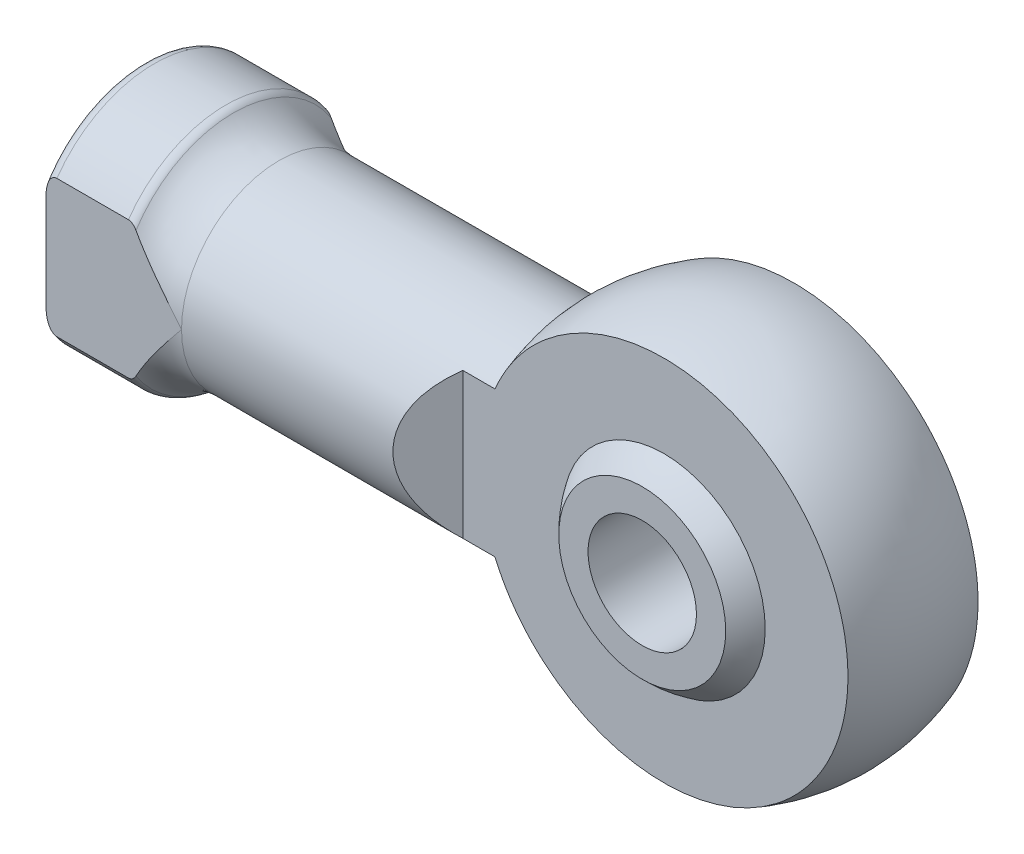
ISO-10303-21;
HEADER;
FILE_DESCRIPTION(('STEP AP214'),'2;1');
FILE_NAME('part.step','',(''),(''),'','','');
FILE_SCHEMA(('AUTOMOTIVE_DESIGN { 1 0 10303 214 1 1 1 1 }'));
ENDSEC;
DATA;
#1=APPLICATION_CONTEXT('core data for automotive mechanical design processes');
#2=APPLICATION_PROTOCOL_DEFINITION('international standard','automotive_design',2000,#1);
#3=PRODUCT_CONTEXT('',#1,'mechanical');
#4=PRODUCT('Part','Part','',(#3));
#5=PRODUCT_RELATED_PRODUCT_CATEGORY('part','',(#4));
#6=PRODUCT_DEFINITION_FORMATION('','',#4);
#7=PRODUCT_DEFINITION_CONTEXT('part definition',#1,'design');
#8=PRODUCT_DEFINITION('design','',#6,#7);
#9=PRODUCT_DEFINITION_SHAPE('','',#8);
#10=(LENGTH_UNIT() NAMED_UNIT(*) SI_UNIT(.MILLI.,.METRE.));
#11=(NAMED_UNIT(*) PLANE_ANGLE_UNIT() SI_UNIT($,.RADIAN.));
#12=(NAMED_UNIT(*) SI_UNIT($,.STERADIAN.) SOLID_ANGLE_UNIT());
#13=UNCERTAINTY_MEASURE_WITH_UNIT(LENGTH_MEASURE(1.E-05),#10,'distance_accuracy_value','');
#14=(GEOMETRIC_REPRESENTATION_CONTEXT(3) GLOBAL_UNCERTAINTY_ASSIGNED_CONTEXT((#13)) GLOBAL_UNIT_ASSIGNED_CONTEXT((#10,
#11,#12)) REPRESENTATION_CONTEXT('',''));
#15=CARTESIAN_POINT('',(0.,0.,0.));
#16=DIRECTION('',(0.,0.,1.));
#17=DIRECTION('',(1.,0.,0.));
#18=AXIS2_PLACEMENT_3D('',#15,#16,#17);
#19=CARTESIAN_POINT('',(6.25,9.,4.5));
#20=DIRECTION('',(0.,0.,1.));
#21=DIRECTION('',(1.,0.,0.));
#22=AXIS2_PLACEMENT_3D('',#19,#20,#21);
#23=PLANE('',#22);
#24=DIRECTION('',(0.,-1.,0.));
#25=VECTOR('',#24,1.);
#26=CARTESIAN_POINT('',(0.,9.,4.5));
#27=LINE('',#26,#25);
#28=CARTESIAN_POINT('',(0.,2.17944947177034,4.5));
#29=VERTEX_POINT('',#28);
#30=CARTESIAN_POINT('',(0.,-2.17944947177034,4.5));
#31=VERTEX_POINT('',#30);
#32=EDGE_CURVE('E257',#29,#31,#27,.T.);
#33=ORIENTED_EDGE('',*,*,#32,.T.);
#34=CARTESIAN_POINT('',(0.5,-3.16227766016838,4.5));
#35=CARTESIAN_POINT('',(0.480088080840636,-3.16234132861897,4.5));
#36=CARTESIAN_POINT('',(0.460256912676583,-3.16021357747644,4.5));
#37=CARTESIAN_POINT('',(0.421622117105667,-3.15215801292039,4.5));
#38=CARTESIAN_POINT('',(0.402808894683854,-3.14627695274917,4.5));
#39=CARTESIAN_POINT('',(0.366643244399612,-3.13130754153173,4.5));
#40=CARTESIAN_POINT('',(0.349284438282355,-3.1222342121437,4.5));
#41=CARTESIAN_POINT('',(0.316118401831963,-3.10153232821695,4.5));
#42=CARTESIAN_POINT('',(0.300316438839926,-3.08989550301312,4.5));
#43=CARTESIAN_POINT('',(0.262352155428732,-3.05792884815441,4.5));
#44=CARTESIAN_POINT('',(0.241307141926944,-3.03627800746923,4.5));
#45=CARTESIAN_POINT('',(0.20281688583608,-2.9900232465804,4.5));
#46=CARTESIAN_POINT('',(0.185378235917553,-2.9654140458679,4.5));
#47=CARTESIAN_POINT('',(0.142724512034432,-2.89673274273593,4.5));
#48=CARTESIAN_POINT('',(0.120382462297768,-2.85089104841473,4.5));
#49=CARTESIAN_POINT('',(0.0824967731479968,-2.75633615906056,4.5));
#50=CARTESIAN_POINT('',(0.066994348872727,-2.70760751019162,4.5));
#51=CARTESIAN_POINT('',(0.0440478734641374,-2.61877804428969,4.5));
#52=CARTESIAN_POINT('',(0.0356081214465431,-2.57892563652366,4.5));
#53=CARTESIAN_POINT('',(0.0216562405281768,-2.49867882914227,4.5));
#54=CARTESIAN_POINT('',(0.0161471732587707,-2.45828390774808,4.5));
#55=CARTESIAN_POINT('',(0.00772408271144477,-2.37814406902478,4.5));
#56=CARTESIAN_POINT('',(0.00475505214159735,-2.33840468462354,4.5));
#57=CARTESIAN_POINT('',(0.000900812729473303,-2.25892104729994,4.5));
#58=CARTESIAN_POINT('',(1.04545811858202E-05,-2.21917705083425,4.5));
#59=CARTESIAN_POINT('',(0.,-2.17944947177034,4.5));
#60=B_SPLINE_CURVE_WITH_KNOTS('',3,(#34,#35,#36,#37,#38,#39,#40,#41,#42,#43,#44,#45,#46,#47,#48,
#49,#50,#51,#52,#53,#54,#55,#56,#57,#58,#59),.UNSPECIFIED.,.F.,.F.,(4,2,2,2,2,2,2,2,2,2,2,2,4),
(0.,0.0594944970276671,0.118261990643713,0.176756565063096,0.235442700304334,0.325510228679832,
0.41574097871482,0.567876125370194,0.720915908284642,0.843001464374794,0.965214311730932,
1.08470818869425,1.20390573881203),.UNSPECIFIED.);
#61=CARTESIAN_POINT('',(0.5,-3.16227766016838,4.5));
#62=VERTEX_POINT('',#61);
#63=EDGE_CURVE('E75',#62,#31,#60,.T.);
#64=ORIENTED_EDGE('',*,*,#63,.F.);
#65=DIRECTION('',(1.,0.,0.));
#66=VECTOR('',#65,1.);
#67=CARTESIAN_POINT('',(27.,-3.16227766016838,4.5));
#68=LINE('',#67,#66);
#69=CARTESIAN_POINT('',(3.80051025721682,-3.16227766016838,4.5));
#70=VERTEX_POINT('',#69);
#71=EDGE_CURVE('E11',#62,#70,#68,.T.);
#72=ORIENTED_EDGE('',*,*,#71,.T.);
#73=CARTESIAN_POINT('',(4.15043736332871,-2.90671284991084,4.5));
#74=CARTESIAN_POINT('',(4.13519017608945,-2.93417390234477,4.5));
#75=CARTESIAN_POINT('',(4.11827662027252,-2.96097707903917,4.5));
#76=CARTESIAN_POINT('',(4.08039016518806,-3.01213119896826,4.5));
#77=CARTESIAN_POINT('',(4.05936001353343,-3.03643917407029,4.5));
#78=CARTESIAN_POINT('',(4.02097092205537,-3.07291975954206,4.5));
#79=CARTESIAN_POINT('',(4.00485766758576,-3.08638189325566,4.5));
#80=CARTESIAN_POINT('',(3.97080304908438,-3.11063758372819,4.5));
#81=CARTESIAN_POINT('',(3.95287018625137,-3.12144280984924,4.5));
#82=CARTESIAN_POINT('',(3.91859881118543,-3.13808403742083,4.5));
#83=CARTESIAN_POINT('',(3.90252292375105,-3.1444567859798,4.5));
#84=CARTESIAN_POINT('',(3.86954012108425,-3.15443339404357,4.5));
#85=CARTESIAN_POINT('',(3.85263460071824,-3.1580417423745,4.5));
#86=CARTESIAN_POINT('',(3.82392719474788,-3.16156598996651,4.5));
#87=CARTESIAN_POINT('',(3.81221996962387,-3.16229317655787,4.5));
#88=CARTESIAN_POINT('',(3.80051025721676,-3.16227766016843,4.5));
#89=B_SPLINE_CURVE_WITH_KNOTS('',3,(#73,#74,#75,#76,#77,#78,#79,#80,#81,#82,#83,#84,#85,#86,#87,
#88),.UNSPECIFIED.,.F.,.F.,(4,2,2,2,2,2,2,4),(0.,0.094558696383488,0.190540240955281,
0.253327355711192,0.315833570377903,0.367502724502551,0.41908779950542,0.454195498738931),.UNSPECIFIED.);
#90=CARTESIAN_POINT('',(4.15043736332871,-2.90671284991084,4.5));
#91=VERTEX_POINT('',#90);
#92=EDGE_CURVE('E270',#91,#70,#89,.T.);
#93=ORIENTED_EDGE('',*,*,#92,.F.);
#94=CARTESIAN_POINT('',(4.15043736332871,-2.90671284991084,4.5));
#95=CARTESIAN_POINT('',(4.29545679370922,-2.64494685727379,4.5));
#96=CARTESIAN_POINT('',(4.45205405947116,-2.3902048749628,4.5));
#97=CARTESIAN_POINT('',(4.78167198673812,-1.89236041245413,4.5));
#98=CARTESIAN_POINT('',(4.95465239234409,-1.64923150252523,4.5));
#99=CARTESIAN_POINT('',(5.488562021829,-0.932794506683372,4.5));
#100=CARTESIAN_POINT('',(5.86507936665166,-0.471431260917382,4.5));
#101=CARTESIAN_POINT('',(6.24434315896506,-0.00692819173573264,4.5));
#102=CARTESIAN_POINT('',(6.24717158622826,-0.00346409002724648,4.5));
#103=CARTESIAN_POINT('',(6.25,0.,4.5));
#104=B_SPLINE_CURVE_WITH_KNOTS('',3,(#94,#95,#96,#97,#98,#99,#100,#101,#102,#103),.UNSPECIFIED.,
.F.,.F.,(4,2,2,2,4),(0.,0.896703960817082,1.7912590823366,3.57684577010444,3.59026217797711),.UNSPECIFIED.);
#105=CARTESIAN_POINT('',(6.25,0.,4.5));
#106=VERTEX_POINT('',#105);
#107=EDGE_CURVE('E280',#106,#91,#104,.F.);
#108=ORIENTED_EDGE('',*,*,#107,.F.);
#109=CARTESIAN_POINT('',(4.15043736332871,2.90671284991083,4.5));
#110=CARTESIAN_POINT('',(4.29545679370892,2.64494685727361,4.5));
#111=CARTESIAN_POINT('',(4.45205405947097,2.39020487496277,4.5));
#112=CARTESIAN_POINT('',(4.78167198673822,1.8923604124543,4.5));
#113=CARTESIAN_POINT('',(4.95465239234437,1.64923150252545,4.5));
#114=CARTESIAN_POINT('',(5.48856202182848,0.932794506682879,4.5));
#115=CARTESIAN_POINT('',(5.86507936664891,0.471431260915111,4.5));
#116=CARTESIAN_POINT('',(6.24434315896501,0.0069281917357058,4.5));
#117=CARTESIAN_POINT('',(6.24717158622824,0.00346409002723295,4.5));
#118=CARTESIAN_POINT('',(6.25,0.,4.5));
#119=B_SPLINE_CURVE_WITH_KNOTS('',3,(#109,#110,#111,#112,#113,#114,#115,#116,#117,#118),
.UNSPECIFIED.,.F.,.F.,(4,2,2,2,4),(0.,0.896703960816925,1.79125908233669,3.57684577010442,
3.59026217797711),.UNSPECIFIED.);
#120=CARTESIAN_POINT('',(4.15043736332871,2.90671284991083,4.5));
#121=VERTEX_POINT('',#120);
#122=EDGE_CURVE('E296',#106,#121,#119,.F.);
#123=ORIENTED_EDGE('',*,*,#122,.T.);
#124=CARTESIAN_POINT('',(4.15043736332871,2.90671284991083,4.5));
#125=CARTESIAN_POINT('',(4.13519017608945,2.93417390234476,4.5));
#126=CARTESIAN_POINT('',(4.11827662027253,2.96097707903916,4.5));
#127=CARTESIAN_POINT('',(4.08039016518807,3.01213119896825,4.5));
#128=CARTESIAN_POINT('',(4.05936001353343,3.03643917407029,4.5));
#129=CARTESIAN_POINT('',(4.02097092205537,3.07291975954206,4.5));
#130=CARTESIAN_POINT('',(4.00485766758576,3.08638189325565,4.5));
#131=CARTESIAN_POINT('',(3.97080304908439,3.11063758372819,4.5));
#132=CARTESIAN_POINT('',(3.95287018625138,3.12144280984924,4.5));
#133=CARTESIAN_POINT('',(3.91859881118544,3.13808403742083,4.5));
#134=CARTESIAN_POINT('',(3.90252292375105,3.1444567859798,4.5));
#135=CARTESIAN_POINT('',(3.86954012108425,3.15443339404357,4.5));
#136=CARTESIAN_POINT('',(3.85263460071825,3.1580417423745,4.5));
#137=CARTESIAN_POINT('',(3.82392719474787,3.16156598996651,4.5));
#138=CARTESIAN_POINT('',(3.81221996962385,3.16229317655787,4.5));
#139=CARTESIAN_POINT('',(3.80051025721674,3.16227766016843,4.5));
#140=B_SPLINE_CURVE_WITH_KNOTS('',3,(#124,#125,#126,#127,#128,#129,#130,#131,#132,#133,#134,
#135,#136,#137,#138,#139),.UNSPECIFIED.,.F.,.F.,(4,2,2,2,2,2,2,4),(0.,0.0945586963834873,
0.190540240955284,0.253327355711196,0.315833570377905,0.367502724502552,0.419087799505422,
0.454195498738968),.UNSPECIFIED.);
#141=CARTESIAN_POINT('',(3.80051025721682,3.16227766016838,4.5));
#142=VERTEX_POINT('',#141);
#143=EDGE_CURVE('E263',#121,#142,#140,.T.);
#144=ORIENTED_EDGE('',*,*,#143,.T.);
#145=DIRECTION('',(1.,0.,0.));
#146=VECTOR('',#145,1.);
#147=CARTESIAN_POINT('',(27.,3.16227766016838,4.5));
#148=LINE('',#147,#146);
#149=CARTESIAN_POINT('',(0.5,3.16227766016838,4.5));
#150=VERTEX_POINT('',#149);
#151=EDGE_CURVE('E87',#150,#142,#148,.T.);
#152=ORIENTED_EDGE('',*,*,#151,.F.);
#153=CARTESIAN_POINT('',(0.,2.17944947177034,4.5));
#154=CARTESIAN_POINT('',(3.4161771872609E-05,2.23149714876583,4.5));
#155=CARTESIAN_POINT('',(0.00154923861714733,2.28360519874073,4.5));
#156=CARTESIAN_POINT('',(0.00833047763083896,2.38802089527408,4.5));
#157=CARTESIAN_POINT('',(0.0136290281784728,2.44032635914118,4.5));
#158=CARTESIAN_POINT('',(0.0289261051967735,2.54521573911492,4.5));
#159=CARTESIAN_POINT('',(0.0390057072317664,2.59778835478667,4.5));
#160=CARTESIAN_POINT('',(0.0650509080235962,2.70132955043979,4.5));
#161=CARTESIAN_POINT('',(0.080992997178679,2.75230366653534,4.5));
#162=CARTESIAN_POINT('',(0.111387450326922,2.82858410021561,4.5));
#163=CARTESIAN_POINT('',(0.12317583495094,2.85495021169118,4.5));
#164=CARTESIAN_POINT('',(0.149318257894238,2.90636591337889,4.5));
#165=CARTESIAN_POINT('',(0.163669312202668,2.93141699139931,4.5));
#166=CARTESIAN_POINT('',(0.195491620775833,2.97982915671642,4.5));
#167=CARTESIAN_POINT('',(0.212991384760455,3.00317180413602,4.5));
#168=CARTESIAN_POINT('',(0.251437856570616,3.0468671371355,4.5));
#169=CARTESIAN_POINT('',(0.272378853241466,3.06722467269774,4.5));
#170=CARTESIAN_POINT('',(0.310195442801235,3.09725948290689,4.5));
#171=CARTESIAN_POINT('',(0.326047591930875,3.10821937792917,4.5));
#172=CARTESIAN_POINT('',(0.359230623256371,3.12753474817549,4.5));
#173=CARTESIAN_POINT('',(0.376556688773563,3.13589832078317,4.5));
#174=CARTESIAN_POINT('',(0.411241020461037,3.14896497728955,4.5));
#175=CARTESIAN_POINT('',(0.428519823110286,3.15387526097503,4.5));
#176=CARTESIAN_POINT('',(0.463843951186992,3.16057034352087,4.5));
#177=CARTESIAN_POINT('',(0.481895214700433,3.16232339084888,4.5));
#178=CARTESIAN_POINT('',(0.5,3.16227766016838,4.5));
#179=B_SPLINE_CURVE_WITH_KNOTS('',3,(#153,#154,#155,#156,#157,#158,#159,#160,#161,#162,#163,
#164,#165,#166,#167,#168,#169,#170,#171,#172,#173,#174,#175,#176,#177,#178),.UNSPECIFIED.,.F.,
.F.,(4,2,2,2,2,2,2,2,2,2,2,2,4),(0.,0.156216029063163,0.313785627250015,0.474128354956719,
0.633834970027321,0.720369202215644,0.806803322006028,0.894063515165601,0.981180325230629,
1.03880709206577,1.09625228433471,1.1498601511043,1.20400419059241),.UNSPECIFIED.);
#180=EDGE_CURVE('E145',#29,#150,#179,.T.);
#181=ORIENTED_EDGE('',*,*,#180,.F.);
#182=EDGE_LOOP('',(#33,#64,#72,#93,#108,#123,#144,#152,#181));
#183=FACE_BOUND('',#182,.T.);
#184=ADVANCED_FACE('F70',(#183),#23,.T.);
#185=CARTESIAN_POINT('',(27.,0.,0.));
#186=DIRECTION('',(-1.,0.,0.));
#187=DIRECTION('',(0.,0.,-1.));
#188=AXIS2_PLACEMENT_3D('',#185,#186,#187);
#189=CYLINDRICAL_SURFACE('',#188,5.5);
#190=ORIENTED_EDGE('',*,*,#71,.F.);
#191=CARTESIAN_POINT('',(0.5,0.,0.));
#192=DIRECTION('',(1.,0.,0.));
#193=DIRECTION('',(0.,0.,-1.));
#194=AXIS2_PLACEMENT_3D('',#191,#192,#193);
#195=CIRCLE('',#194,5.5);
#196=CARTESIAN_POINT('',(0.5,-3.16227766016838,-4.5));
#197=VERTEX_POINT('',#196);
#198=EDGE_CURVE('E259',#62,#197,#195,.T.);
#199=ORIENTED_EDGE('',*,*,#198,.T.);
#200=DIRECTION('',(1.,0.,0.));
#201=VECTOR('',#200,1.);
#202=CARTESIAN_POINT('',(27.,-3.16227766016838,-4.5));
#203=LINE('',#202,#201);
#204=CARTESIAN_POINT('',(3.80051025721682,-3.16227766016838,-4.5));
#205=VERTEX_POINT('',#204);
#206=EDGE_CURVE('E251',#197,#205,#203,.T.);
#207=ORIENTED_EDGE('',*,*,#206,.T.);
#208=CARTESIAN_POINT('',(3.80051025721682,0.,0.));
#209=DIRECTION('',(-1.,0.,0.));
#210=DIRECTION('',(0.,0.,1.));
#211=AXIS2_PLACEMENT_3D('',#208,#209,#210);
#212=CIRCLE('',#211,5.5);
#213=EDGE_CURVE('E269',#70,#205,#212,.F.);
#214=ORIENTED_EDGE('',*,*,#213,.F.);
#215=EDGE_LOOP('',(#190,#199,#207,#214));
#216=FACE_BOUND('',#215,.T.);
#217=ADVANCED_FACE('F292',(#216),#189,.T.);
#218=DIRECTION('',(1.,0.,0.));
#219=VECTOR('',#218,1.);
#220=CARTESIAN_POINT('',(27.,3.16227766016838,-4.5));
#221=LINE('',#220,#219);
#222=CARTESIAN_POINT('',(0.5,3.16227766016838,-4.5));
#223=VERTEX_POINT('',#222);
#224=CARTESIAN_POINT('',(3.80051025721682,3.16227766016838,-4.5));
#225=VERTEX_POINT('',#224);
#226=EDGE_CURVE('E245',#223,#225,#221,.T.);
#227=ORIENTED_EDGE('',*,*,#226,.F.);
#228=EDGE_CURVE('E158',#223,#150,#195,.T.);
#229=ORIENTED_EDGE('',*,*,#228,.T.);
#230=ORIENTED_EDGE('',*,*,#151,.T.);
#231=EDGE_CURVE('E928',#225,#142,#212,.F.);
#232=ORIENTED_EDGE('',*,*,#231,.F.);
#233=EDGE_LOOP('',(#227,#229,#230,#232));
#234=FACE_BOUND('',#233,.T.);
#235=ADVANCED_FACE('F527',(#234),#189,.T.);
#236=CARTESIAN_POINT('',(3.80051025721682,0.,0.));
#237=DIRECTION('',(-1.,0.,0.));
#238=DIRECTION('',(0.,0.,1.));
#239=AXIS2_PLACEMENT_3D('',#236,#237,#238);
#240=TOROIDAL_SURFACE('',#239,5.,0.500000000000009);
#241=CARTESIAN_POINT('',(4.15043736332871,0.,0.));
#242=DIRECTION('',(1.,0.,0.));
#243=DIRECTION('',(0.,0.,-1.));
#244=AXIS2_PLACEMENT_3D('',#241,#242,#243);
#245=CIRCLE('',#244,5.35714285714286);
#246=CARTESIAN_POINT('',(4.15043736332871,2.90671284991084,-4.5));
#247=VERTEX_POINT('',#246);
#248=EDGE_CURVE('E944',#247,#121,#245,.T.);
#249=ORIENTED_EDGE('',*,*,#248,.F.);
#250=CARTESIAN_POINT('',(4.15043736332871,2.90671284991084,-4.5));
#251=CARTESIAN_POINT('',(4.13519017608945,2.93417390234477,-4.5));
#252=CARTESIAN_POINT('',(4.11827662027252,2.96097707903917,-4.5));
#253=CARTESIAN_POINT('',(4.08039016518806,3.01213119896826,-4.5));
#254=CARTESIAN_POINT('',(4.05936001353343,3.03643917407029,-4.5));
#255=CARTESIAN_POINT('',(4.02097092205537,3.07291975954206,-4.5));
#256=CARTESIAN_POINT('',(4.00485766758576,3.08638189325566,-4.5));
#257=CARTESIAN_POINT('',(3.97080304908438,3.11063758372819,-4.5));
#258=CARTESIAN_POINT('',(3.95287018625137,3.12144280984924,-4.5));
#259=CARTESIAN_POINT('',(3.91859881118543,3.13808403742083,-4.5));
#260=CARTESIAN_POINT('',(3.90252292375105,3.1444567859798,-4.5));
#261=CARTESIAN_POINT('',(3.86954012108425,3.15443339404357,-4.5));
#262=CARTESIAN_POINT('',(3.85263460071824,3.1580417423745,-4.5));
#263=CARTESIAN_POINT('',(3.82392719474788,3.16156598996651,-4.5));
#264=CARTESIAN_POINT('',(3.81221996962387,3.16229317655787,-4.5));
#265=CARTESIAN_POINT('',(3.80051025721676,3.16227766016843,-4.5));
#266=B_SPLINE_CURVE_WITH_KNOTS('',3,(#250,#251,#252,#253,#254,#255,#256,#257,#258,#259,#260,
#261,#262,#263,#264,#265),.UNSPECIFIED.,.F.,.F.,(4,2,2,2,2,2,2,4),(0.,0.094558696383488,
0.190540240955281,0.253327355711192,0.315833570377903,0.367502724502551,0.41908779950542,
0.454195498738931),.UNSPECIFIED.);
#267=EDGE_CURVE('E249',#247,#225,#266,.T.);
#268=ORIENTED_EDGE('',*,*,#267,.T.);
#269=ORIENTED_EDGE('',*,*,#231,.T.);
#270=ORIENTED_EDGE('',*,*,#143,.F.);
#271=EDGE_LOOP('',(#249,#268,#269,#270));
#272=FACE_BOUND('',#271,.T.);
#273=ADVANCED_FACE('F514',(#272),#240,.T.);
#274=CARTESIAN_POINT('',(6.25,0.,0.));
#275=DIRECTION('',(-1.,0.,0.));
#276=DIRECTION('',(0.,0.,1.));
#277=AXIS2_PLACEMENT_3D('',#274,#275,#276);
#278=TOROIDAL_SURFACE('',#277,7.5,3.);
#279=ORIENTED_EDGE('',*,*,#107,.T.);
#280=CARTESIAN_POINT('',(4.15043736332871,-2.90671284991084,-4.5));
#281=VERTEX_POINT('',#280);
#282=EDGE_CURVE('E279',#91,#281,#245,.T.);
#283=ORIENTED_EDGE('',*,*,#282,.T.);
#284=CARTESIAN_POINT('',(4.15043736332871,-2.90671284991083,-4.5));
#285=CARTESIAN_POINT('',(4.29545679370892,-2.64494685727361,-4.5));
#286=CARTESIAN_POINT('',(4.45205405947097,-2.39020487496277,-4.5));
#287=CARTESIAN_POINT('',(4.78167198673822,-1.8923604124543,-4.5));
#288=CARTESIAN_POINT('',(4.95465239234437,-1.64923150252545,-4.5));
#289=CARTESIAN_POINT('',(5.48856202182848,-0.932794506682879,-4.5));
#290=CARTESIAN_POINT('',(5.86507936664891,-0.471431260915111,-4.5));
#291=CARTESIAN_POINT('',(6.24434315896501,-0.0069281917357058,-4.5));
#292=CARTESIAN_POINT('',(6.24717158622824,-0.00346409002723295,-4.5));
#293=CARTESIAN_POINT('',(6.25,0.,-4.5));
#294=B_SPLINE_CURVE_WITH_KNOTS('',3,(#284,#285,#286,#287,#288,#289,#290,#291,#292,#293),
.UNSPECIFIED.,.F.,.F.,(4,2,2,2,4),(0.,0.896703960816925,1.79125908233669,3.57684577010442,
3.59026217797711),.UNSPECIFIED.);
#295=CARTESIAN_POINT('',(6.25,0.,-4.5));
#296=VERTEX_POINT('',#295);
#297=EDGE_CURVE('E365',#296,#281,#294,.F.);
#298=ORIENTED_EDGE('',*,*,#297,.F.);
#299=CARTESIAN_POINT('',(6.25,0.,0.));
#300=DIRECTION('',(-1.,0.,0.));
#301=DIRECTION('',(0.,0.,1.));
#302=AXIS2_PLACEMENT_3D('',#299,#300,#301);
#303=CIRCLE('',#302,4.5);
#304=EDGE_CURVE('E197',#106,#296,#303,.F.);
#305=ORIENTED_EDGE('',*,*,#304,.F.);
#306=EDGE_LOOP('',(#279,#283,#298,#305));
#307=FACE_BOUND('',#306,.T.);
#308=ADVANCED_FACE('F501',(#307),#278,.F.);
#309=CARTESIAN_POINT('',(4.15043736332871,2.90671284991084,-4.5));
#310=CARTESIAN_POINT('',(4.29545679370922,2.64494685727379,-4.5));
#311=CARTESIAN_POINT('',(4.45205405947116,2.3902048749628,-4.5));
#312=CARTESIAN_POINT('',(4.78167198673812,1.89236041245413,-4.5));
#313=CARTESIAN_POINT('',(4.95465239234409,1.64923150252523,-4.5));
#314=CARTESIAN_POINT('',(5.488562021829,0.932794506683372,-4.5));
#315=CARTESIAN_POINT('',(5.86507936665166,0.471431260917382,-4.5));
#316=CARTESIAN_POINT('',(6.24434315896506,0.00692819173573264,-4.5));
#317=CARTESIAN_POINT('',(6.24717158622826,0.00346409002724648,-4.5));
#318=CARTESIAN_POINT('',(6.25,0.,-4.5));
#319=B_SPLINE_CURVE_WITH_KNOTS('',3,(#309,#310,#311,#312,#313,#314,#315,#316,#317,#318),
.UNSPECIFIED.,.F.,.F.,(4,2,2,2,4),(0.,0.896703960817082,1.7912590823366,3.57684577010444,
3.59026217797711),.UNSPECIFIED.);
#320=EDGE_CURVE('E360',#296,#247,#319,.F.);
#321=ORIENTED_EDGE('',*,*,#320,.T.);
#322=ORIENTED_EDGE('',*,*,#248,.T.);
#323=ORIENTED_EDGE('',*,*,#122,.F.);
#324=EDGE_CURVE('E946',#296,#106,#303,.F.);
#325=ORIENTED_EDGE('',*,*,#324,.F.);
#326=EDGE_LOOP('',(#321,#322,#323,#325));
#327=FACE_BOUND('',#326,.T.);
#328=ADVANCED_FACE('F379',(#327),#278,.F.);
#329=CARTESIAN_POINT('',(27.,0.,0.));
#330=DIRECTION('',(1.,0.,0.));
#331=DIRECTION('',(0.,-1.,0.));
#332=AXIS2_PLACEMENT_3D('',#329,#330,#331);
#333=SPHERICAL_SURFACE('',#332,9.);
#334=CARTESIAN_POINT('',(19.2057713659401,0.,0.));
#335=DIRECTION('',(1.,0.,0.));
#336=DIRECTION('',(0.,0.,-1.));
#337=AXIS2_PLACEMENT_3D('',#334,#335,#336);
#338=CIRCLE('',#337,4.5);
#339=CARTESIAN_POINT('',(19.2057713659401,3.35410196624968,-3.));
#340=VERTEX_POINT('',#339);
#341=CARTESIAN_POINT('',(19.2057713659401,3.35410196624968,3.));
#342=VERTEX_POINT('',#341);
#343=EDGE_CURVE('E198',#340,#342,#338,.T.);
#344=ORIENTED_EDGE('',*,*,#343,.T.);
#345=CARTESIAN_POINT('',(27.,0.,3.));
#346=DIRECTION('',(0.,0.,1.));
#347=DIRECTION('',(1.,0.,0.));
#348=AXIS2_PLACEMENT_3D('',#345,#346,#347);
#349=CIRCLE('',#348,8.48528137423857);
#350=CARTESIAN_POINT('',(19.2057713659401,-3.35410196624968,3.));
#351=VERTEX_POINT('',#350);
#352=EDGE_CURVE('E201',#351,#342,#349,.T.);
#353=ORIENTED_EDGE('',*,*,#352,.F.);
#354=CARTESIAN_POINT('',(19.2057713659401,-3.35410196624968,-3.));
#355=VERTEX_POINT('',#354);
#356=EDGE_CURVE('E183',#351,#355,#338,.T.);
#357=ORIENTED_EDGE('',*,*,#356,.T.);
#358=CARTESIAN_POINT('',(27.,0.,-3.));
#359=DIRECTION('',(0.,0.,-1.));
#360=DIRECTION('',(-1.,0.,0.));
#361=AXIS2_PLACEMENT_3D('',#358,#359,#360);
#362=CIRCLE('',#361,8.48528137423857);
#363=EDGE_CURVE('E238',#340,#355,#362,.T.);
#364=ORIENTED_EDGE('',*,*,#363,.F.);
#365=EDGE_LOOP('',(#344,#353,#357,#364));
#366=FACE_BOUND('',#365,.T.);
#367=ADVANCED_FACE('F202',(#366),#333,.T.);
#368=CARTESIAN_POINT('',(27.,0.,0.));
#369=DIRECTION('',(-1.,0.,0.));
#370=DIRECTION('',(0.,0.,-1.));
#371=AXIS2_PLACEMENT_3D('',#368,#369,#370);
#372=CYLINDRICAL_SURFACE('',#371,4.5);
#373=ORIENTED_EDGE('',*,*,#304,.T.);
#374=ORIENTED_EDGE('',*,*,#324,.T.);
#375=EDGE_LOOP('',(#373,#374));
#376=FACE_BOUND('',#375,.T.);
#377=DIRECTION('',(1.,0.,0.));
#378=VECTOR('',#377,1.);
#379=CARTESIAN_POINT('',(27.,3.35410196624969,3.));
#380=LINE('',#379,#378);
#381=CARTESIAN_POINT('',(17.7255526108315,3.35410196624969,3.));
#382=VERTEX_POINT('',#381);
#383=EDGE_CURVE('E205',#382,#342,#380,.T.);
#384=ORIENTED_EDGE('',*,*,#383,.T.);
#385=ORIENTED_EDGE('',*,*,#343,.F.);
#386=DIRECTION('',(1.,0.,0.));
#387=VECTOR('',#386,1.);
#388=CARTESIAN_POINT('',(27.,3.35410196624969,-3.));
#389=LINE('',#388,#387);
#390=CARTESIAN_POINT('',(17.7255526108315,3.35410196624969,-3.));
#391=VERTEX_POINT('',#390);
#392=EDGE_CURVE('E242',#391,#340,#389,.T.);
#393=ORIENTED_EDGE('',*,*,#392,.F.);
#394=CARTESIAN_POINT('',(21.1766578324945,0.,0.));
#395=DIRECTION('',(0.656059028990508,0.,-0.754709580222771));
#396=DIRECTION('',(0.754709580222771,0.,0.656059028990508));
#397=AXIS2_PLACEMENT_3D('',#394,#395,#396);
#398=ELLIPSE('',#397,6.85913889017616,4.5);
#399=CARTESIAN_POINT('',(17.7255526108315,-3.35410196624969,-3.));
#400=VERTEX_POINT('',#399);
#401=EDGE_CURVE('E220',#400,#391,#398,.T.);
#402=ORIENTED_EDGE('',*,*,#401,.F.);
#403=DIRECTION('',(1.,0.,0.));
#404=VECTOR('',#403,1.);
#405=CARTESIAN_POINT('',(27.,-3.35410196624969,-3.));
#406=LINE('',#405,#404);
#407=EDGE_CURVE('E192',#400,#355,#406,.T.);
#408=ORIENTED_EDGE('',*,*,#407,.T.);
#409=ORIENTED_EDGE('',*,*,#356,.F.);
#410=DIRECTION('',(1.,0.,0.));
#411=VECTOR('',#410,1.);
#412=CARTESIAN_POINT('',(27.,-3.35410196624969,3.));
#413=LINE('',#412,#411);
#414=CARTESIAN_POINT('',(17.7255526108315,-3.35410196624969,3.));
#415=VERTEX_POINT('',#414);
#416=EDGE_CURVE('E189',#415,#351,#413,.T.);
#417=ORIENTED_EDGE('',*,*,#416,.F.);
#418=CARTESIAN_POINT('',(21.1766578324945,0.,0.));
#419=DIRECTION('',(0.656059028990508,0.,0.754709580222771));
#420=DIRECTION('',(0.754709580222771,0.,-0.656059028990508));
#421=AXIS2_PLACEMENT_3D('',#418,#419,#420);
#422=ELLIPSE('',#421,6.85913889017616,4.5);
#423=EDGE_CURVE('E228',#382,#415,#422,.T.);
#424=ORIENTED_EDGE('',*,*,#423,.F.);
#425=EDGE_LOOP('',(#384,#385,#393,#402,#408,#409,#417,#424));
#426=FACE_BOUND('',#425,.T.);
#427=ADVANCED_FACE('F186',(#376,#426),#372,.T.);
#428=CARTESIAN_POINT('',(0.5,0.,0.));
#429=DIRECTION('',(1.,0.,0.));
#430=DIRECTION('',(0.,0.,-1.));
#431=AXIS2_PLACEMENT_3D('',#428,#429,#430);
#432=TOROIDAL_SURFACE('',#431,5.,0.5);
#433=ORIENTED_EDGE('',*,*,#228,.F.);
#434=CARTESIAN_POINT('',(0.5,3.16227766016838,-4.5));
#435=CARTESIAN_POINT('',(0.480088080840636,3.16234132861897,-4.5));
#436=CARTESIAN_POINT('',(0.460256912676583,3.16021357747644,-4.5));
#437=CARTESIAN_POINT('',(0.421622117105667,3.15215801292039,-4.5));
#438=CARTESIAN_POINT('',(0.402808894683854,3.14627695274917,-4.5));
#439=CARTESIAN_POINT('',(0.366643244399612,3.13130754153173,-4.5));
#440=CARTESIAN_POINT('',(0.349284438282355,3.1222342121437,-4.5));
#441=CARTESIAN_POINT('',(0.316118401831963,3.10153232821695,-4.5));
#442=CARTESIAN_POINT('',(0.300316438839926,3.08989550301312,-4.5));
#443=CARTESIAN_POINT('',(0.262352155428732,3.05792884815441,-4.5));
#444=CARTESIAN_POINT('',(0.241307141926944,3.03627800746923,-4.5));
#445=CARTESIAN_POINT('',(0.20281688583608,2.9900232465804,-4.5));
#446=CARTESIAN_POINT('',(0.185378235917553,2.9654140458679,-4.5));
#447=CARTESIAN_POINT('',(0.142724512034432,2.89673274273593,-4.5));
#448=CARTESIAN_POINT('',(0.120382462297768,2.85089104841473,-4.5));
#449=CARTESIAN_POINT('',(0.0824967731479968,2.75633615906056,-4.5));
#450=CARTESIAN_POINT('',(0.066994348872727,2.70760751019162,-4.5));
#451=CARTESIAN_POINT('',(0.0440478734641374,2.61877804428969,-4.5));
#452=CARTESIAN_POINT('',(0.0356081214465431,2.57892563652366,-4.5));
#453=CARTESIAN_POINT('',(0.0216562405281768,2.49867882914227,-4.5));
#454=CARTESIAN_POINT('',(0.0161471732587707,2.45828390774808,-4.5));
#455=CARTESIAN_POINT('',(0.00772408271144477,2.37814406902478,-4.5));
#456=CARTESIAN_POINT('',(0.00475505214159735,2.33840468462354,-4.5));
#457=CARTESIAN_POINT('',(0.000900812729473303,2.25892104729994,-4.5));
#458=CARTESIAN_POINT('',(1.04545811858202E-05,2.21917705083425,-4.5));
#459=CARTESIAN_POINT('',(0.,2.17944947177034,-4.5));
#460=B_SPLINE_CURVE_WITH_KNOTS('',3,(#434,#435,#436,#437,#438,#439,#440,#441,#442,#443,#444,
#445,#446,#447,#448,#449,#450,#451,#452,#453,#454,#455,#456,#457,#458,#459),.UNSPECIFIED.,.F.,
.F.,(4,2,2,2,2,2,2,2,2,2,2,2,4),(0.,0.0594944970276671,0.118261990643713,0.176756565063096,
0.235442700304334,0.325510228679832,0.41574097871482,0.567876125370194,0.720915908284642,
0.843001464374794,0.965214311730932,1.08470818869425,1.20390573881203),.UNSPECIFIED.);
#461=CARTESIAN_POINT('',(0.,2.17944947177034,-4.5));
#462=VERTEX_POINT('',#461);
#463=EDGE_CURVE('E324',#223,#462,#460,.T.);
#464=ORIENTED_EDGE('',*,*,#463,.T.);
#465=CARTESIAN_POINT('',(0.,0.,0.));
#466=DIRECTION('',(1.,0.,0.));
#467=DIRECTION('',(0.,0.,-1.));
#468=AXIS2_PLACEMENT_3D('',#465,#466,#467);
#469=CIRCLE('',#468,5.);
#470=EDGE_CURVE('E403',#462,#29,#469,.T.);
#471=ORIENTED_EDGE('',*,*,#470,.T.);
#472=ORIENTED_EDGE('',*,*,#180,.T.);
#473=EDGE_LOOP('',(#433,#464,#471,#472));
#474=FACE_BOUND('',#473,.T.);
#475=ADVANCED_FACE('F382',(#474),#432,.T.);
#476=ORIENTED_EDGE('',*,*,#198,.F.);
#477=ORIENTED_EDGE('',*,*,#63,.T.);
#478=CARTESIAN_POINT('',(0.,-2.17944947177034,-4.5));
#479=VERTEX_POINT('',#478);
#480=EDGE_CURVE('E260',#31,#479,#469,.T.);
#481=ORIENTED_EDGE('',*,*,#480,.T.);
#482=CARTESIAN_POINT('',(0.,-2.17944947177034,-4.5));
#483=CARTESIAN_POINT('',(3.4161771872609E-05,-2.23149714876583,-4.5));
#484=CARTESIAN_POINT('',(0.00154923861714733,-2.28360519874073,-4.5));
#485=CARTESIAN_POINT('',(0.00833047763083896,-2.38802089527408,-4.5));
#486=CARTESIAN_POINT('',(0.0136290281784728,-2.44032635914118,-4.5));
#487=CARTESIAN_POINT('',(0.0289261051967735,-2.54521573911492,-4.5));
#488=CARTESIAN_POINT('',(0.0390057072317664,-2.59778835478667,-4.5));
#489=CARTESIAN_POINT('',(0.0650509080235962,-2.70132955043979,-4.5));
#490=CARTESIAN_POINT('',(0.080992997178679,-2.75230366653534,-4.5));
#491=CARTESIAN_POINT('',(0.111387450326922,-2.82858410021561,-4.5));
#492=CARTESIAN_POINT('',(0.12317583495094,-2.85495021169118,-4.5));
#493=CARTESIAN_POINT('',(0.149318257894238,-2.90636591337889,-4.5));
#494=CARTESIAN_POINT('',(0.163669312202668,-2.93141699139931,-4.5));
#495=CARTESIAN_POINT('',(0.195491620775833,-2.97982915671642,-4.5));
#496=CARTESIAN_POINT('',(0.212991384760455,-3.00317180413602,-4.5));
#497=CARTESIAN_POINT('',(0.251437856570616,-3.0468671371355,-4.5));
#498=CARTESIAN_POINT('',(0.272378853241466,-3.06722467269774,-4.5));
#499=CARTESIAN_POINT('',(0.310195442801235,-3.09725948290689,-4.5));
#500=CARTESIAN_POINT('',(0.326047591930875,-3.10821937792917,-4.5));
#501=CARTESIAN_POINT('',(0.359230623256371,-3.12753474817549,-4.5));
#502=CARTESIAN_POINT('',(0.376556688773563,-3.13589832078317,-4.5));
#503=CARTESIAN_POINT('',(0.411241020461037,-3.14896497728955,-4.5));
#504=CARTESIAN_POINT('',(0.428519823110286,-3.15387526097503,-4.5));
#505=CARTESIAN_POINT('',(0.463843951186992,-3.16057034352087,-4.5));
#506=CARTESIAN_POINT('',(0.481895214700433,-3.16232339084888,-4.5));
#507=CARTESIAN_POINT('',(0.5,-3.16227766016838,-4.5));
#508=B_SPLINE_CURVE_WITH_KNOTS('',3,(#482,#483,#484,#485,#486,#487,#488,#489,#490,#491,#492,
#493,#494,#495,#496,#497,#498,#499,#500,#501,#502,#503,#504,#505,#506,#507),.UNSPECIFIED.,.F.,
.F.,(4,2,2,2,2,2,2,2,2,2,2,2,4),(0.,0.156216029063163,0.313785627250015,0.474128354956719,
0.633834970027321,0.720369202215644,0.806803322006028,0.894063515165601,0.981180325230629,
1.03880709206577,1.09625228433471,1.1498601511043,1.20400419059241),.UNSPECIFIED.);
#509=EDGE_CURVE('E255',#479,#197,#508,.T.);
#510=ORIENTED_EDGE('',*,*,#509,.T.);
#511=EDGE_LOOP('',(#476,#477,#481,#510));
#512=FACE_BOUND('',#511,.T.);
#513=ADVANCED_FACE('F72',(#512),#432,.T.);
#514=CARTESIAN_POINT('',(0.,0.,0.));
#515=DIRECTION('',(1.,0.,0.));
#516=DIRECTION('',(0.,0.,-1.));
#517=AXIS2_PLACEMENT_3D('',#514,#515,#516);
#518=PLANE('',#517);
#519=CARTESIAN_POINT('',(0.,0.,0.));
#520=DIRECTION('',(-1.,0.,0.));
#521=DIRECTION('',(0.,0.,1.));
#522=AXIS2_PLACEMENT_3D('',#519,#520,#521);
#523=CIRCLE('',#522,1.64999999999999);
#524=CARTESIAN_POINT('',(0.,0.,1.64999999999999));
#525=VERTEX_POINT('',#524);
#526=EDGE_CURVE('E907',#525,#525,#523,.T.);
#527=ORIENTED_EDGE('',*,*,#526,.F.);
#528=EDGE_LOOP('',(#527));
#529=FACE_BOUND('',#528,.T.);
#530=ORIENTED_EDGE('',*,*,#470,.F.);
#531=DIRECTION('',(0.,-1.,0.));
#532=VECTOR('',#531,1.);
#533=CARTESIAN_POINT('',(0.,9.,-4.5));
#534=LINE('',#533,#532);
#535=EDGE_CURVE('E331',#462,#479,#534,.T.);
#536=ORIENTED_EDGE('',*,*,#535,.T.);
#537=ORIENTED_EDGE('',*,*,#480,.F.);
#538=ORIENTED_EDGE('',*,*,#32,.F.);
#539=EDGE_LOOP('',(#530,#536,#537,#538));
#540=FACE_BOUND('',#539,.T.);
#541=ADVANCED_FACE('F384',(#529,#540),#518,.F.);
#542=CARTESIAN_POINT('',(36.,9.,3.));
#543=DIRECTION('',(0.,0.,1.));
#544=DIRECTION('',(1.,0.,0.));
#545=AXIS2_PLACEMENT_3D('',#542,#543,#544);
#546=PLANE('',#545);
#547=ORIENTED_EDGE('',*,*,#416,.T.);
#548=ORIENTED_EDGE('',*,*,#352,.T.);
#549=ORIENTED_EDGE('',*,*,#383,.F.);
#550=DIRECTION('',(0.,-1.,0.));
#551=VECTOR('',#550,1.);
#552=CARTESIAN_POINT('',(17.7255526108315,9.,3.));
#553=LINE('',#552,#551);
#554=EDGE_CURVE('E210',#382,#415,#553,.T.);
#555=ORIENTED_EDGE('',*,*,#554,.T.);
#556=EDGE_LOOP('',(#547,#548,#549,#555));
#557=FACE_BOUND('',#556,.T.);
#558=CARTESIAN_POINT('',(27.,0.,3.));
#559=DIRECTION('',(0.,0.,1.));
#560=DIRECTION('',(1.,0.,0.));
#561=AXIS2_PLACEMENT_3D('',#558,#559,#560);
#562=CIRCLE('',#561,4.67145587584855);
#563=CARTESIAN_POINT('',(31.6714558758485,0.,3.));
#564=VERTEX_POINT('',#563);
#565=EDGE_CURVE('E213',#564,#564,#562,.T.);
#566=ORIENTED_EDGE('',*,*,#565,.F.);
#567=EDGE_LOOP('',(#566));
#568=FACE_BOUND('',#567,.T.);
#569=ADVANCED_FACE('F207',(#557,#568),#546,.T.);
#570=CARTESIAN_POINT('',(16.,9.,-4.5));
#571=DIRECTION('',(0.656059028990508,0.,-0.754709580222771));
#572=DIRECTION('',(-0.754709580222771,0.,-0.656059028990508));
#573=AXIS2_PLACEMENT_3D('',#570,#571,#572);
#574=PLANE('',#573);
#575=ORIENTED_EDGE('',*,*,#401,.T.);
#576=DIRECTION('',(0.,-1.,0.));
#577=VECTOR('',#576,1.);
#578=CARTESIAN_POINT('',(17.7255526108315,9.,-3.));
#579=LINE('',#578,#577);
#580=EDGE_CURVE('E230',#391,#400,#579,.T.);
#581=ORIENTED_EDGE('',*,*,#580,.T.);
#582=EDGE_LOOP('',(#575,#581));
#583=FACE_BOUND('',#582,.T.);
#584=ADVANCED_FACE('F390',(#583),#574,.T.);
#585=CARTESIAN_POINT('',(17.7255526108315,9.,3.));
#586=DIRECTION('',(0.656059028990508,0.,0.754709580222771));
#587=DIRECTION('',(0.754709580222771,0.,-0.656059028990508));
#588=AXIS2_PLACEMENT_3D('',#585,#586,#587);
#589=PLANE('',#588);
#590=ORIENTED_EDGE('',*,*,#423,.T.);
#591=ORIENTED_EDGE('',*,*,#554,.F.);
#592=EDGE_LOOP('',(#590,#591));
#593=FACE_BOUND('',#592,.T.);
#594=ADVANCED_FACE('F392',(#593),#589,.T.);
#595=CARTESIAN_POINT('',(17.7255526108315,9.,-3.));
#596=DIRECTION('',(0.,0.,-1.));
#597=DIRECTION('',(-1.,0.,0.));
#598=AXIS2_PLACEMENT_3D('',#595,#596,#597);
#599=PLANE('',#598);
#600=ORIENTED_EDGE('',*,*,#392,.T.);
#601=ORIENTED_EDGE('',*,*,#363,.T.);
#602=ORIENTED_EDGE('',*,*,#407,.F.);
#603=ORIENTED_EDGE('',*,*,#580,.F.);
#604=EDGE_LOOP('',(#600,#601,#602,#603));
#605=FACE_BOUND('',#604,.T.);
#606=CARTESIAN_POINT('',(27.,0.,-3.));
#607=DIRECTION('',(0.,0.,-1.));
#608=DIRECTION('',(-1.,0.,0.));
#609=AXIS2_PLACEMENT_3D('',#606,#607,#608);
#610=CIRCLE('',#609,4.67145587584855);
#611=CARTESIAN_POINT('',(22.3285441241515,0.,-3.));
#612=VERTEX_POINT('',#611);
#613=EDGE_CURVE('E265',#612,#612,#610,.T.);
#614=ORIENTED_EDGE('',*,*,#613,.F.);
#615=EDGE_LOOP('',(#614));
#616=FACE_BOUND('',#615,.T.);
#617=ADVANCED_FACE('F342',(#605,#616),#599,.T.);
#618=ORIENTED_EDGE('',*,*,#282,.F.);
#619=ORIENTED_EDGE('',*,*,#92,.T.);
#620=ORIENTED_EDGE('',*,*,#213,.T.);
#621=CARTESIAN_POINT('',(4.15043736332871,-2.90671284991083,-4.5));
#622=CARTESIAN_POINT('',(4.13519017608945,-2.93417390234476,-4.5));
#623=CARTESIAN_POINT('',(4.11827662027253,-2.96097707903916,-4.5));
#624=CARTESIAN_POINT('',(4.08039016518807,-3.01213119896825,-4.5));
#625=CARTESIAN_POINT('',(4.05936001353343,-3.03643917407029,-4.5));
#626=CARTESIAN_POINT('',(4.02097092205537,-3.07291975954206,-4.5));
#627=CARTESIAN_POINT('',(4.00485766758576,-3.08638189325565,-4.5));
#628=CARTESIAN_POINT('',(3.97080304908439,-3.11063758372819,-4.5));
#629=CARTESIAN_POINT('',(3.95287018625138,-3.12144280984924,-4.5));
#630=CARTESIAN_POINT('',(3.91859881118544,-3.13808403742083,-4.5));
#631=CARTESIAN_POINT('',(3.90252292375105,-3.1444567859798,-4.5));
#632=CARTESIAN_POINT('',(3.86954012108425,-3.15443339404357,-4.5));
#633=CARTESIAN_POINT('',(3.85263460071825,-3.1580417423745,-4.5));
#634=CARTESIAN_POINT('',(3.82392719474787,-3.16156598996651,-4.5));
#635=CARTESIAN_POINT('',(3.81221996962385,-3.16229317655787,-4.5));
#636=CARTESIAN_POINT('',(3.80051025721674,-3.16227766016843,-4.5));
#637=B_SPLINE_CURVE_WITH_KNOTS('',3,(#621,#622,#623,#624,#625,#626,#627,#628,#629,#630,#631,
#632,#633,#634,#635,#636),.UNSPECIFIED.,.F.,.F.,(4,2,2,2,2,2,2,4),(0.,0.0945586963834873,
0.190540240955284,0.253327355711196,0.315833570377905,0.367502724502552,0.419087799505422,
0.454195498738968),.UNSPECIFIED.);
#638=EDGE_CURVE('E256',#281,#205,#637,.T.);
#639=ORIENTED_EDGE('',*,*,#638,.F.);
#640=EDGE_LOOP('',(#618,#619,#620,#639));
#641=FACE_BOUND('',#640,.T.);
#642=ADVANCED_FACE('F293',(#641),#240,.T.);
#643=CARTESIAN_POINT('',(0.,9.,-4.5));
#644=DIRECTION('',(0.,0.,-1.));
#645=DIRECTION('',(-1.,0.,0.));
#646=AXIS2_PLACEMENT_3D('',#643,#644,#645);
#647=PLANE('',#646);
#648=ORIENTED_EDGE('',*,*,#226,.T.);
#649=ORIENTED_EDGE('',*,*,#267,.F.);
#650=ORIENTED_EDGE('',*,*,#320,.F.);
#651=ORIENTED_EDGE('',*,*,#297,.T.);
#652=ORIENTED_EDGE('',*,*,#638,.T.);
#653=ORIENTED_EDGE('',*,*,#206,.F.);
#654=ORIENTED_EDGE('',*,*,#509,.F.);
#655=ORIENTED_EDGE('',*,*,#535,.F.);
#656=ORIENTED_EDGE('',*,*,#463,.F.);
#657=EDGE_LOOP('',(#648,#649,#650,#651,#652,#653,#654,#655,#656));
#658=FACE_BOUND('',#657,.T.);
#659=ADVANCED_FACE('F333',(#658),#647,.T.);
#660=CARTESIAN_POINT('',(27.,0.,0.));
#661=DIRECTION('',(1.,0.,0.));
#662=DIRECTION('',(0.,-1.,0.));
#663=AXIS2_PLACEMENT_3D('',#660,#661,#662);
#664=SPHERICAL_SURFACE('',#663,5.55180150942016);
#665=CARTESIAN_POINT('',(27.,0.,0.));
#666=DIRECTION('',(0.,0.,1.));
#667=DIRECTION('',(1.,0.,0.));
#668=AXIS2_PLACEMENT_3D('',#665,#666,#667);
#669=SPHERICAL_SURFACE('',#668,5.55180150942016);
#670=ORIENTED_EDGE('',*,*,#565,.T.);
#671=EDGE_LOOP('',(#670));
#672=FACE_BOUND('',#671,.T.);
#673=CARTESIAN_POINT('',(27.,0.,4.));
#674=DIRECTION('',(0.,0.,1.));
#675=DIRECTION('',(1.,0.,0.));
#676=AXIS2_PLACEMENT_3D('',#673,#674,#675);
#677=CIRCLE('',#676,3.85);
#678=CARTESIAN_POINT('',(30.85,0.,4.));
#679=VERTEX_POINT('',#678);
#680=EDGE_CURVE('E250',#679,#679,#677,.T.);
#681=ORIENTED_EDGE('',*,*,#680,.F.);
#682=EDGE_LOOP('',(#681));
#683=FACE_BOUND('',#682,.T.);
#684=ADVANCED_FACE('F338',(#672,#683),#669,.T.);
#685=CARTESIAN_POINT('',(36.,8.,4.));
#686=DIRECTION('',(0.,0.,1.));
#687=DIRECTION('',(1.,0.,0.));
#688=AXIS2_PLACEMENT_3D('',#685,#686,#687);
#689=PLANE('',#688);
#690=ORIENTED_EDGE('',*,*,#680,.T.);
#691=EDGE_LOOP('',(#690));
#692=FACE_BOUND('',#691,.T.);
#693=CARTESIAN_POINT('',(27.,0.,4.));
#694=DIRECTION('',(0.,0.,1.));
#695=DIRECTION('',(1.,0.,0.));
#696=AXIS2_PLACEMENT_3D('',#693,#694,#695);
#697=CIRCLE('',#696,2.5);
#698=CARTESIAN_POINT('',(29.5,0.,4.));
#699=VERTEX_POINT('',#698);
#700=EDGE_CURVE('E879',#699,#699,#697,.T.);
#701=ORIENTED_EDGE('',*,*,#700,.F.);
#702=EDGE_LOOP('',(#701));
#703=FACE_BOUND('',#702,.T.);
#704=ADVANCED_FACE('F340',(#692,#703),#689,.T.);
#705=CARTESIAN_POINT('',(27.,0.,0.));
#706=DIRECTION('',(0.,0.,-1.));
#707=DIRECTION('',(-1.,0.,0.));
#708=AXIS2_PLACEMENT_3D('',#705,#706,#707);
#709=SPHERICAL_SURFACE('',#708,5.55180150942016);
#710=ORIENTED_EDGE('',*,*,#613,.T.);
#711=EDGE_LOOP('',(#710));
#712=FACE_BOUND('',#711,.T.);
#713=CARTESIAN_POINT('',(27.,0.,-4.));
#714=DIRECTION('',(0.,0.,-1.));
#715=DIRECTION('',(-1.,0.,0.));
#716=AXIS2_PLACEMENT_3D('',#713,#714,#715);
#717=CIRCLE('',#716,3.85);
#718=CARTESIAN_POINT('',(23.15,0.,-4.));
#719=VERTEX_POINT('',#718);
#720=EDGE_CURVE('E888',#719,#719,#717,.T.);
#721=ORIENTED_EDGE('',*,*,#720,.F.);
#722=EDGE_LOOP('',(#721));
#723=FACE_BOUND('',#722,.T.);
#724=ADVANCED_FACE('F634',(#712,#723),#709,.T.);
#725=CARTESIAN_POINT('',(16.5751842036105,8.,-4.));
#726=DIRECTION('',(0.,0.,-1.));
#727=DIRECTION('',(-1.,0.,0.));
#728=AXIS2_PLACEMENT_3D('',#725,#726,#727);
#729=PLANE('',#728);
#730=ORIENTED_EDGE('',*,*,#720,.T.);
#731=EDGE_LOOP('',(#730));
#732=FACE_BOUND('',#731,.T.);
#733=CARTESIAN_POINT('',(27.,0.,-4.));
#734=DIRECTION('',(0.,0.,1.));
#735=DIRECTION('',(1.,0.,0.));
#736=AXIS2_PLACEMENT_3D('',#733,#734,#735);
#737=CIRCLE('',#736,2.5);
#738=CARTESIAN_POINT('',(29.5,0.,-4.));
#739=VERTEX_POINT('',#738);
#740=EDGE_CURVE('E883',#739,#739,#737,.T.);
#741=ORIENTED_EDGE('',*,*,#740,.T.);
#742=EDGE_LOOP('',(#741));
#743=FACE_BOUND('',#742,.T.);
#744=ADVANCED_FACE('F652',(#732,#743),#729,.T.);
#745=CARTESIAN_POINT('',(27.,0.,4.));
#746=DIRECTION('',(0.,0.,1.));
#747=DIRECTION('',(-1.,0.,0.));
#748=AXIS2_PLACEMENT_3D('',#745,#746,#747);
#749=CYLINDRICAL_SURFACE('',#748,2.5);
#750=ORIENTED_EDGE('',*,*,#740,.F.);
#751=EDGE_LOOP('',(#750));
#752=FACE_BOUND('',#751,.T.);
#753=ORIENTED_EDGE('',*,*,#700,.T.);
#754=EDGE_LOOP('',(#753));
#755=FACE_BOUND('',#754,.T.);
#756=ADVANCED_FACE('F662',(#752,#755),#749,.F.);
#757=CARTESIAN_POINT('',(12.1,0.,0.));
#758=DIRECTION('',(-1.,0.,0.));
#759=DIRECTION('',(0.,0.,1.));
#760=AXIS2_PLACEMENT_3D('',#757,#758,#759);
#761=CONICAL_SURFACE('',#760,1.65,1.02974425867665);
#762=CARTESIAN_POINT('',(13.0914200213955,0.,0.));
#763=VERTEX_POINT('',#762);
#764=VERTEX_LOOP('',#763);
#765=FACE_BOUND('',#764,.T.);
#766=CARTESIAN_POINT('',(12.1,0.,0.));
#767=DIRECTION('',(-1.,0.,0.));
#768=DIRECTION('',(0.,0.,1.));
#769=AXIS2_PLACEMENT_3D('',#766,#767,#768);
#770=CIRCLE('',#769,1.65);
#771=CARTESIAN_POINT('',(12.1,0.,1.65));
#772=VERTEX_POINT('',#771);
#773=EDGE_CURVE('E884',#772,#772,#770,.T.);
#774=ORIENTED_EDGE('',*,*,#773,.T.);
#775=EDGE_LOOP('',(#774));
#776=FACE_BOUND('',#775,.T.);
#777=ADVANCED_FACE('F672',(#765,#776),#761,.F.);
#778=CARTESIAN_POINT('',(0.,0.,0.));
#779=DIRECTION('',(-1.,0.,0.));
#780=DIRECTION('',(0.,0.,1.));
#781=AXIS2_PLACEMENT_3D('',#778,#779,#780);
#782=CYLINDRICAL_SURFACE('',#781,1.64999999999999);
#783=ORIENTED_EDGE('',*,*,#773,.F.);
#784=EDGE_LOOP('',(#783));
#785=FACE_BOUND('',#784,.T.);
#786=ORIENTED_EDGE('',*,*,#526,.T.);
#787=EDGE_LOOP('',(#786));
#788=FACE_BOUND('',#787,.T.);
#789=ADVANCED_FACE('F732',(#785,#788),#782,.F.);
#790=CLOSED_SHELL('',(#184,#217,#235,#273,#308,#328,#367,#427,#475,#513,#541,#569,#584,#594,
#617,#642,#659,#684,#704,#724,#744,#756,#777,#789));
#791=MANIFOLD_SOLID_BREP('B2',#790);
#792=ADVANCED_BREP_SHAPE_REPRESENTATION('',(#18,#791),#14);
#793=SHAPE_DEFINITION_REPRESENTATION(#9,#792);
ENDSEC;
END-ISO-10303-21;
